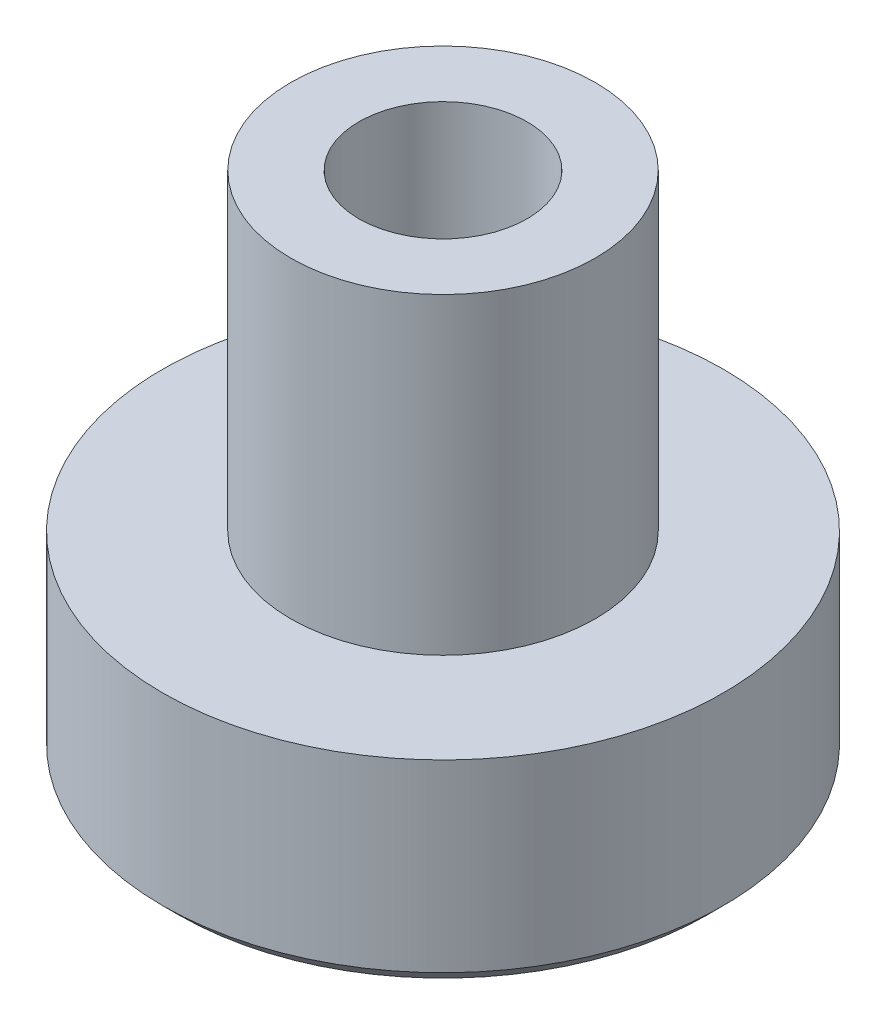
ISO-10303-21;
HEADER;
FILE_DESCRIPTION(('STEP AP214'),'2;1');
FILE_NAME('part.step','',(''),(''),'','','');
FILE_SCHEMA(('AUTOMOTIVE_DESIGN { 1 0 10303 214 1 1 1 1 }'));
ENDSEC;
DATA;
#1=APPLICATION_CONTEXT('core data for automotive mechanical design processes');
#2=APPLICATION_PROTOCOL_DEFINITION('international standard','automotive_design',2000,#1);
#3=PRODUCT_CONTEXT('',#1,'mechanical');
#4=PRODUCT('Part','Part','',(#3));
#5=PRODUCT_RELATED_PRODUCT_CATEGORY('part','',(#4));
#6=PRODUCT_DEFINITION_FORMATION('','',#4);
#7=PRODUCT_DEFINITION_CONTEXT('part definition',#1,'design');
#8=PRODUCT_DEFINITION('design','',#6,#7);
#9=PRODUCT_DEFINITION_SHAPE('','',#8);
#10=(LENGTH_UNIT() NAMED_UNIT(*) SI_UNIT(.MILLI.,.METRE.));
#11=(NAMED_UNIT(*) PLANE_ANGLE_UNIT() SI_UNIT($,.RADIAN.));
#12=(NAMED_UNIT(*) SI_UNIT($,.STERADIAN.) SOLID_ANGLE_UNIT());
#13=UNCERTAINTY_MEASURE_WITH_UNIT(LENGTH_MEASURE(1.E-05),#10,'distance_accuracy_value','');
#14=(GEOMETRIC_REPRESENTATION_CONTEXT(3) GLOBAL_UNCERTAINTY_ASSIGNED_CONTEXT((#13)) GLOBAL_UNIT_ASSIGNED_CONTEXT((#10,
#11,#12)) REPRESENTATION_CONTEXT('',''));
#15=CARTESIAN_POINT('',(0.,0.,0.));
#16=DIRECTION('',(0.,0.,1.));
#17=DIRECTION('',(1.,0.,0.));
#18=AXIS2_PLACEMENT_3D('',#15,#16,#17);
#19=CARTESIAN_POINT('',(0.,5.,0.));
#20=DIRECTION('',(0.,1.,0.));
#21=DIRECTION('',(0.,0.,1.));
#22=AXIS2_PLACEMENT_3D('',#19,#20,#21);
#23=PLANE('',#22);
#24=CARTESIAN_POINT('',(0.,5.,0.));
#25=DIRECTION('',(0.,1.,0.));
#26=DIRECTION('',(0.,0.,1.));
#27=AXIS2_PLACEMENT_3D('',#24,#25,#26);
#28=CIRCLE('',#27,7.);
#29=CARTESIAN_POINT('',(0.,5.,7.));
#30=VERTEX_POINT('',#29);
#31=EDGE_CURVE('E49',#30,#30,#28,.T.);
#32=ORIENTED_EDGE('',*,*,#31,.T.);
#33=EDGE_LOOP('',(#32));
#34=FACE_BOUND('',#33,.T.);
#35=CARTESIAN_POINT('',(0.,5.,0.));
#36=DIRECTION('',(0.,1.,0.));
#37=DIRECTION('',(0.,0.,1.));
#38=AXIS2_PLACEMENT_3D('',#35,#36,#37);
#39=CIRCLE('',#38,3.8);
#40=CARTESIAN_POINT('',(0.,5.,3.8));
#41=VERTEX_POINT('',#40);
#42=EDGE_CURVE('E59',#41,#41,#39,.T.);
#43=ORIENTED_EDGE('',*,*,#42,.F.);
#44=EDGE_LOOP('',(#43));
#45=FACE_BOUND('',#44,.T.);
#46=ADVANCED_FACE('F37',(#34,#45),#23,.T.);
#47=CARTESIAN_POINT('',(0.,0.,0.));
#48=DIRECTION('',(0.,1.,0.));
#49=DIRECTION('',(0.,0.,1.));
#50=AXIS2_PLACEMENT_3D('',#47,#48,#49);
#51=PLANE('',#50);
#52=CARTESIAN_POINT('',(0.,0.,0.));
#53=DIRECTION('',(0.,1.,0.));
#54=DIRECTION('',(0.,0.,1.));
#55=AXIS2_PLACEMENT_3D('',#52,#53,#54);
#56=CIRCLE('',#55,6.6);
#57=CARTESIAN_POINT('',(0.,0.,6.6));
#58=VERTEX_POINT('',#57);
#59=EDGE_CURVE('E10',#58,#58,#56,.F.);
#60=ORIENTED_EDGE('',*,*,#59,.T.);
#61=EDGE_LOOP('',(#60));
#62=FACE_BOUND('',#61,.T.);
#63=CARTESIAN_POINT('',(0.,0.,0.));
#64=DIRECTION('',(0.,1.,0.));
#65=DIRECTION('',(0.,0.,1.));
#66=AXIS2_PLACEMENT_3D('',#63,#64,#65);
#67=CIRCLE('',#66,2.1);
#68=CARTESIAN_POINT('',(0.,0.,2.1));
#69=VERTEX_POINT('',#68);
#70=EDGE_CURVE('E53',#69,#69,#67,.T.);
#71=ORIENTED_EDGE('',*,*,#70,.T.);
#72=EDGE_LOOP('',(#71));
#73=FACE_BOUND('',#72,.T.);
#74=ADVANCED_FACE('F85',(#62,#73),#51,.F.);
#75=CARTESIAN_POINT('',(0.,5.,0.));
#76=DIRECTION('',(0.,-1.,0.));
#77=DIRECTION('',(0.,0.,-1.));
#78=AXIS2_PLACEMENT_3D('',#75,#76,#77);
#79=CYLINDRICAL_SURFACE('',#78,7.);
#80=CARTESIAN_POINT('',(0.,0.399999869282058,0.));
#81=DIRECTION('',(0.,1.,0.));
#82=DIRECTION('',(0.,0.,1.));
#83=AXIS2_PLACEMENT_3D('',#80,#81,#82);
#84=CIRCLE('',#83,7.);
#85=CARTESIAN_POINT('',(0.,0.399999869282058,7.));
#86=VERTEX_POINT('',#85);
#87=EDGE_CURVE('E45',#86,#86,#84,.T.);
#88=ORIENTED_EDGE('',*,*,#87,.T.);
#89=EDGE_LOOP('',(#88));
#90=FACE_BOUND('',#89,.T.);
#91=ORIENTED_EDGE('',*,*,#31,.F.);
#92=EDGE_LOOP('',(#91));
#93=FACE_BOUND('',#92,.T.);
#94=ADVANCED_FACE('F81',(#90,#93),#79,.T.);
#95=CARTESIAN_POINT('',(0.,5.,0.));
#96=DIRECTION('',(0.,-1.,0.));
#97=DIRECTION('',(0.,0.,-1.));
#98=AXIS2_PLACEMENT_3D('',#95,#96,#97);
#99=CYLINDRICAL_SURFACE('',#98,2.1);
#100=ORIENTED_EDGE('',*,*,#70,.F.);
#101=EDGE_LOOP('',(#100));
#102=FACE_BOUND('',#101,.T.);
#103=CARTESIAN_POINT('',(0.,12.8,0.));
#104=DIRECTION('',(0.,1.,0.));
#105=DIRECTION('',(0.,0.,1.));
#106=AXIS2_PLACEMENT_3D('',#103,#104,#105);
#107=CIRCLE('',#106,2.1);
#108=CARTESIAN_POINT('',(0.,12.8,2.1));
#109=VERTEX_POINT('',#108);
#110=EDGE_CURVE('E62',#109,#109,#107,.T.);
#111=ORIENTED_EDGE('',*,*,#110,.T.);
#112=EDGE_LOOP('',(#111));
#113=FACE_BOUND('',#112,.T.);
#114=ADVANCED_FACE('F68',(#102,#113),#99,.F.);
#115=CARTESIAN_POINT('',(0.,12.8,0.));
#116=DIRECTION('',(0.,1.,0.));
#117=DIRECTION('',(0.,0.,1.));
#118=AXIS2_PLACEMENT_3D('',#115,#116,#117);
#119=PLANE('',#118);
#120=CARTESIAN_POINT('',(0.,12.8,0.));
#121=DIRECTION('',(0.,1.,0.));
#122=DIRECTION('',(0.,0.,1.));
#123=AXIS2_PLACEMENT_3D('',#120,#121,#122);
#124=CIRCLE('',#123,3.8);
#125=CARTESIAN_POINT('',(0.,12.8,3.8));
#126=VERTEX_POINT('',#125);
#127=EDGE_CURVE('E58',#126,#126,#124,.T.);
#128=ORIENTED_EDGE('',*,*,#127,.T.);
#129=EDGE_LOOP('',(#128));
#130=FACE_BOUND('',#129,.T.);
#131=ORIENTED_EDGE('',*,*,#110,.F.);
#132=EDGE_LOOP('',(#131));
#133=FACE_BOUND('',#132,.T.);
#134=ADVANCED_FACE('F70',(#130,#133),#119,.T.);
#135=CARTESIAN_POINT('',(0.,12.8,0.));
#136=DIRECTION('',(0.,-1.,0.));
#137=DIRECTION('',(0.,0.,-1.));
#138=AXIS2_PLACEMENT_3D('',#135,#136,#137);
#139=CYLINDRICAL_SURFACE('',#138,3.8);
#140=ORIENTED_EDGE('',*,*,#127,.F.);
#141=EDGE_LOOP('',(#140));
#142=FACE_BOUND('',#141,.T.);
#143=ORIENTED_EDGE('',*,*,#42,.T.);
#144=EDGE_LOOP('',(#143));
#145=FACE_BOUND('',#144,.T.);
#146=ADVANCED_FACE('F72',(#142,#145),#139,.T.);
#147=CARTESIAN_POINT('',(0.,0.399999869282058,0.));
#148=DIRECTION('',(0.,1.,0.));
#149=DIRECTION('',(0.,0.,1.));
#150=AXIS2_PLACEMENT_3D('',#147,#148,#149);
#151=CONICAL_SURFACE('',#150,7.,0.785398326794901);
#152=ORIENTED_EDGE('',*,*,#59,.F.);
#153=EDGE_LOOP('',(#152));
#154=FACE_BOUND('',#153,.T.);
#155=ORIENTED_EDGE('',*,*,#87,.F.);
#156=EDGE_LOOP('',(#155));
#157=FACE_BOUND('',#156,.T.);
#158=ADVANCED_FACE('F40',(#154,#157),#151,.T.);
#159=CLOSED_SHELL('',(#46,#74,#94,#114,#134,#146,#158));
#160=MANIFOLD_SOLID_BREP('B2',#159);
#161=ADVANCED_BREP_SHAPE_REPRESENTATION('',(#18,#160),#14);
#162=SHAPE_DEFINITION_REPRESENTATION(#9,#161);
ENDSEC;
END-ISO-10303-21;
